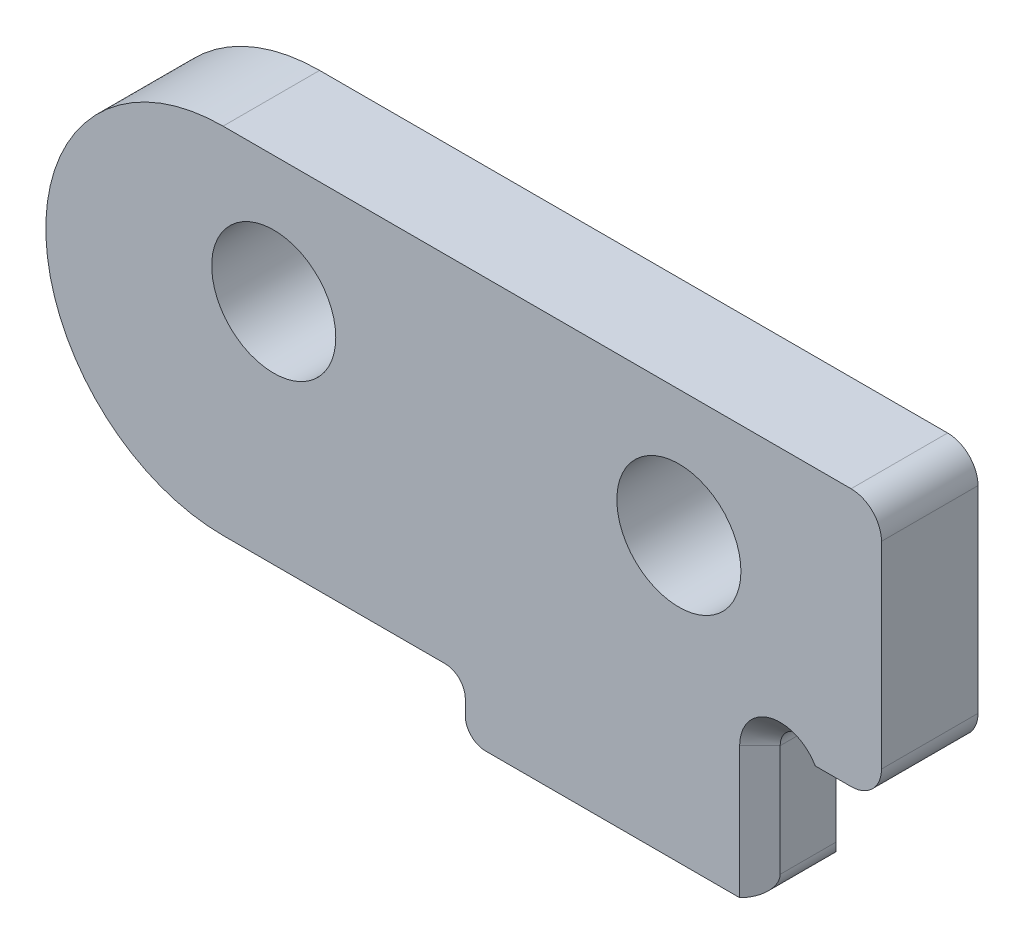
ISO-10303-21;
HEADER;
FILE_DESCRIPTION(('STEP AP214'),'2;1');
FILE_NAME('part.step','',(''),(''),'','','');
FILE_SCHEMA(('AUTOMOTIVE_DESIGN { 1 0 10303 214 1 1 1 1 }'));
ENDSEC;
DATA;
#1=APPLICATION_CONTEXT('core data for automotive mechanical design processes');
#2=APPLICATION_PROTOCOL_DEFINITION('international standard','automotive_design',2000,#1);
#3=PRODUCT_CONTEXT('',#1,'mechanical');
#4=PRODUCT('Part','Part','',(#3));
#5=PRODUCT_RELATED_PRODUCT_CATEGORY('part','',(#4));
#6=PRODUCT_DEFINITION_FORMATION('','',#4);
#7=PRODUCT_DEFINITION_CONTEXT('part definition',#1,'design');
#8=PRODUCT_DEFINITION('design','',#6,#7);
#9=PRODUCT_DEFINITION_SHAPE('','',#8);
#10=(LENGTH_UNIT() NAMED_UNIT(*) SI_UNIT(.MILLI.,.METRE.));
#11=(NAMED_UNIT(*) PLANE_ANGLE_UNIT() SI_UNIT($,.RADIAN.));
#12=(NAMED_UNIT(*) SI_UNIT($,.STERADIAN.) SOLID_ANGLE_UNIT());
#13=UNCERTAINTY_MEASURE_WITH_UNIT(LENGTH_MEASURE(1.E-05),#10,'distance_accuracy_value','');
#14=(GEOMETRIC_REPRESENTATION_CONTEXT(3) GLOBAL_UNCERTAINTY_ASSIGNED_CONTEXT((#13)) GLOBAL_UNIT_ASSIGNED_CONTEXT((#10,
#11,#12)) REPRESENTATION_CONTEXT('',''));
#15=CARTESIAN_POINT('',(0.,0.,0.));
#16=DIRECTION('',(0.,0.,1.));
#17=DIRECTION('',(1.,0.,0.));
#18=AXIS2_PLACEMENT_3D('',#15,#16,#17);
#19=CARTESIAN_POINT('',(-5.,-5.,-1.11022302462516E-13));
#20=DIRECTION('',(0.,0.,1.));
#21=DIRECTION('',(1.,0.,0.));
#22=AXIS2_PLACEMENT_3D('',#19,#20,#21);
#23=PLANE('',#22);
#24=CARTESIAN_POINT('',(40.,0.,-1.11022302462516E-13));
#25=DIRECTION('',(0.,0.,1.));
#26=DIRECTION('',(1.,0.,0.));
#27=AXIS2_PLACEMENT_3D('',#24,#25,#26);
#28=CIRCLE('',#27,6.125);
#29=CARTESIAN_POINT('',(46.125,0.,-1.12042319846968E-13));
#30=VERTEX_POINT('',#29);
#31=EDGE_CURVE('E189',#30,#30,#28,.T.);
#32=ORIENTED_EDGE('',*,*,#31,.T.);
#33=EDGE_LOOP('',(#32));
#34=FACE_BOUND('',#33,.T.);
#35=CARTESIAN_POINT('',(0.,0.,0.));
#36=DIRECTION('',(0.,0.,1.));
#37=DIRECTION('',(1.,0.,0.));
#38=AXIS2_PLACEMENT_3D('',#35,#36,#37);
#39=CIRCLE('',#38,6.125);
#40=CARTESIAN_POINT('',(6.125,0.,0.));
#41=VERTEX_POINT('',#40);
#42=EDGE_CURVE('E183',#41,#41,#39,.T.);
#43=ORIENTED_EDGE('',*,*,#42,.T.);
#44=EDGE_LOOP('',(#43));
#45=FACE_BOUND('',#44,.T.);
#46=DIRECTION('',(1.,0.,0.));
#47=VECTOR('',#46,1.);
#48=CARTESIAN_POINT('',(59.9999999999999,-12.9700000000001,1.11022302462516E-13));
#49=LINE('',#48,#47);
#50=CARTESIAN_POINT('',(53.4641016151377,-12.9700000000001,0.));
#51=VERTEX_POINT('',#50);
#52=CARTESIAN_POINT('',(56.9999999999999,-12.9700000000001,0.));
#53=VERTEX_POINT('',#52);
#54=EDGE_CURVE('E388',#51,#53,#49,.T.);
#55=ORIENTED_EDGE('',*,*,#54,.F.);
#56=CARTESIAN_POINT('',(49.9999999999999,-14.9700000000001,1.11022302462516E-13));
#57=DIRECTION('',(0.,0.,1.));
#58=DIRECTION('',(1.,0.,0.));
#59=AXIS2_PLACEMENT_3D('',#56,#57,#58);
#60=CIRCLE('',#59,4.00000000000002);
#61=CARTESIAN_POINT('',(45.9999999999999,-14.9700000000001,0.));
#62=VERTEX_POINT('',#61);
#63=EDGE_CURVE('E252',#51,#62,#60,.T.);
#64=ORIENTED_EDGE('',*,*,#63,.T.);
#65=DIRECTION('',(0.,-1.,0.));
#66=VECTOR('',#65,1.);
#67=CARTESIAN_POINT('',(45.9999999999999,-5.00000000000003,-1.11022302462516E-13));
#68=LINE('',#67,#66);
#69=CARTESIAN_POINT('',(45.9999999999998,-27.9700000000001,0.));
#70=VERTEX_POINT('',#69);
#71=EDGE_CURVE('E250',#62,#70,#68,.T.);
#72=ORIENTED_EDGE('',*,*,#71,.T.);
#73=DIRECTION('',(1.,0.,0.));
#74=VECTOR('',#73,1.);
#75=CARTESIAN_POINT('',(130.,-27.9700000000001,0.));
#76=LINE('',#75,#74);
#77=CARTESIAN_POINT('',(20.9151051592226,-27.9700000000001,0.));
#78=VERTEX_POINT('',#77);
#79=EDGE_CURVE('E198',#70,#78,#76,.F.);
#80=ORIENTED_EDGE('',*,*,#79,.T.);
#81=CARTESIAN_POINT('',(20.9151051592227,-25.97,-1.11022302462516E-13));
#82=DIRECTION('',(0.,0.,1.));
#83=DIRECTION('',(1.,0.,0.));
#84=AXIS2_PLACEMENT_3D('',#81,#82,#83);
#85=CIRCLE('',#84,2.);
#86=CARTESIAN_POINT('',(18.9151051592227,-25.97,-1.11022302462516E-13));
#87=VERTEX_POINT('',#86);
#88=EDGE_CURVE('E236',#78,#87,#85,.F.);
#89=ORIENTED_EDGE('',*,*,#88,.T.);
#90=DIRECTION('',(0.,1.,0.));
#91=VECTOR('',#90,1.);
#92=CARTESIAN_POINT('',(18.9151051592226,-27.97,0.));
#93=LINE('',#92,#91);
#94=CARTESIAN_POINT('',(18.9151051592227,-24.5,-1.11022302462516E-13));
#95=VERTEX_POINT('',#94);
#96=EDGE_CURVE('E355',#87,#95,#93,.T.);
#97=ORIENTED_EDGE('',*,*,#96,.T.);
#98=CARTESIAN_POINT('',(16.9151051592227,-24.5,-1.11022302462516E-13));
#99=DIRECTION('',(0.,0.,1.));
#100=DIRECTION('',(1.,0.,0.));
#101=AXIS2_PLACEMENT_3D('',#98,#99,#100);
#102=CIRCLE('',#101,2.);
#103=CARTESIAN_POINT('',(16.9151051592228,-22.5,-1.11022302462516E-13));
#104=VERTEX_POINT('',#103);
#105=EDGE_CURVE('E175',#95,#104,#102,.T.);
#106=ORIENTED_EDGE('',*,*,#105,.T.);
#107=DIRECTION('',(1.,0.,0.));
#108=VECTOR('',#107,1.);
#109=CARTESIAN_POINT('',(45.,-22.5,-1.11022302462516E-13));
#110=LINE('',#109,#108);
#111=CARTESIAN_POINT('',(-5.,-22.5,-1.11022302462516E-13));
#112=VERTEX_POINT('',#111);
#113=EDGE_CURVE('E158',#112,#104,#110,.T.);
#114=ORIENTED_EDGE('',*,*,#113,.F.);
#115=CARTESIAN_POINT('',(-5.,-5.,-1.11022302462516E-13));
#116=DIRECTION('',(0.,0.,1.));
#117=DIRECTION('',(1.,0.,0.));
#118=AXIS2_PLACEMENT_3D('',#115,#116,#117);
#119=CIRCLE('',#118,17.5);
#120=CARTESIAN_POINT('',(-5.00000000000012,12.5,-1.11022302462516E-13));
#121=VERTEX_POINT('',#120);
#122=EDGE_CURVE('E173',#121,#112,#119,.T.);
#123=ORIENTED_EDGE('',*,*,#122,.F.);
#124=DIRECTION('',(-1.,0.,0.));
#125=VECTOR('',#124,1.);
#126=CARTESIAN_POINT('',(-5.00000000000012,12.5,-1.11022302462516E-13));
#127=LINE('',#126,#125);
#128=CARTESIAN_POINT('',(56.9999999999999,12.5,-1.11022302462516E-13));
#129=VERTEX_POINT('',#128);
#130=EDGE_CURVE('E181',#129,#121,#127,.T.);
#131=ORIENTED_EDGE('',*,*,#130,.F.);
#132=CARTESIAN_POINT('',(56.9999999999999,9.49999999999997,-1.11022302462516E-13));
#133=DIRECTION('',(0.,0.,1.));
#134=DIRECTION('',(1.,0.,0.));
#135=AXIS2_PLACEMENT_3D('',#132,#133,#134);
#136=CIRCLE('',#135,3.);
#137=CARTESIAN_POINT('',(59.9999999999999,9.49999999999997,-1.11022302462516E-13));
#138=VERTEX_POINT('',#137);
#139=EDGE_CURVE('E209',#129,#138,#136,.F.);
#140=ORIENTED_EDGE('',*,*,#139,.T.);
#141=DIRECTION('',(0.,1.,0.));
#142=VECTOR('',#141,1.);
#143=CARTESIAN_POINT('',(59.9999999999999,-47.0300000000002,1.11022302462516E-13));
#144=LINE('',#143,#142);
#145=CARTESIAN_POINT('',(59.9999999999999,-9.97000000000006,0.));
#146=VERTEX_POINT('',#145);
#147=EDGE_CURVE('E383',#146,#138,#144,.T.);
#148=ORIENTED_EDGE('',*,*,#147,.F.);
#149=CARTESIAN_POINT('',(56.9999999999999,-9.97000000000006,-1.11022302462516E-13));
#150=DIRECTION('',(0.,0.,1.));
#151=DIRECTION('',(1.,0.,0.));
#152=AXIS2_PLACEMENT_3D('',#149,#150,#151);
#153=CIRCLE('',#152,3.);
#154=EDGE_CURVE('E211',#146,#53,#153,.F.);
#155=ORIENTED_EDGE('',*,*,#154,.T.);
#156=EDGE_LOOP('',(#55,#64,#72,#80,#89,#97,#106,#114,#123,#131,#140,#148,#155));
#157=FACE_BOUND('',#156,.T.);
#158=ADVANCED_FACE('F40',(#34,#45,#157),#23,.F.);
#159=CARTESIAN_POINT('',(-5.,-5.00000000000001,9.52999999999993));
#160=DIRECTION('',(0.,0.,1.));
#161=DIRECTION('',(1.,0.,0.));
#162=AXIS2_PLACEMENT_3D('',#159,#160,#161);
#163=PLANE('',#162);
#164=DIRECTION('',(0.,1.,0.));
#165=VECTOR('',#164,1.);
#166=CARTESIAN_POINT('',(46.,-14.9700000000001,9.53000000000004));
#167=LINE('',#166,#165);
#168=CARTESIAN_POINT('',(45.9999999999999,-27.9700000000001,9.52999999999993));
#169=VERTEX_POINT('',#168);
#170=CARTESIAN_POINT('',(46.,-14.9700000000001,9.53000000000004));
#171=VERTEX_POINT('',#170);
#172=EDGE_CURVE('E370',#169,#171,#167,.T.);
#173=ORIENTED_EDGE('',*,*,#172,.T.);
#174=CARTESIAN_POINT('',(50.,-14.9700000000001,9.53000000000004));
#175=DIRECTION('',(0.,0.,1.));
#176=DIRECTION('',(1.,0.,0.));
#177=AXIS2_PLACEMENT_3D('',#174,#175,#176);
#178=CIRCLE('',#177,4.00000000000002);
#179=CARTESIAN_POINT('',(53.4641016151377,-12.9700000000001,9.53000000000004));
#180=VERTEX_POINT('',#179);
#181=EDGE_CURVE('E366',#171,#180,#178,.F.);
#182=ORIENTED_EDGE('',*,*,#181,.T.);
#183=DIRECTION('',(1.,0.,0.));
#184=VECTOR('',#183,1.);
#185=CARTESIAN_POINT('',(59.9999999999999,-12.9700000000001,9.53000000000004));
#186=LINE('',#185,#184);
#187=CARTESIAN_POINT('',(56.9999999999999,-12.9700000000001,9.53000000000004));
#188=VERTEX_POINT('',#187);
#189=EDGE_CURVE('E390',#180,#188,#186,.T.);
#190=ORIENTED_EDGE('',*,*,#189,.T.);
#191=CARTESIAN_POINT('',(56.9999999999999,-9.97000000000006,9.52999999999993));
#192=DIRECTION('',(0.,0.,1.));
#193=DIRECTION('',(1.,0.,0.));
#194=AXIS2_PLACEMENT_3D('',#191,#192,#193);
#195=CIRCLE('',#194,3.);
#196=CARTESIAN_POINT('',(59.9999999999999,-9.97000000000006,9.53000000000004));
#197=VERTEX_POINT('',#196);
#198=EDGE_CURVE('E219',#188,#197,#195,.T.);
#199=ORIENTED_EDGE('',*,*,#198,.T.);
#200=DIRECTION('',(0.,-1.,0.));
#201=VECTOR('',#200,1.);
#202=CARTESIAN_POINT('',(59.9999999999999,-5.00000000000004,9.53000000000004));
#203=LINE('',#202,#201);
#204=CARTESIAN_POINT('',(59.9999999999999,9.49999999999997,9.52999999999993));
#205=VERTEX_POINT('',#204);
#206=EDGE_CURVE('E380',#205,#197,#203,.T.);
#207=ORIENTED_EDGE('',*,*,#206,.F.);
#208=CARTESIAN_POINT('',(56.9999999999999,9.49999999999997,9.52999999999982));
#209=DIRECTION('',(0.,0.,1.));
#210=DIRECTION('',(1.,0.,0.));
#211=AXIS2_PLACEMENT_3D('',#208,#209,#210);
#212=CIRCLE('',#211,3.);
#213=CARTESIAN_POINT('',(56.9999999999999,12.5,9.52999999999982));
#214=VERTEX_POINT('',#213);
#215=EDGE_CURVE('E217',#205,#214,#212,.T.);
#216=ORIENTED_EDGE('',*,*,#215,.T.);
#217=DIRECTION('',(1.,0.,0.));
#218=VECTOR('',#217,1.);
#219=CARTESIAN_POINT('',(-5.00000000000012,12.5,9.52999999999993));
#220=LINE('',#219,#218);
#221=CARTESIAN_POINT('',(-5.00000000000012,12.5,9.52999999999993));
#222=VERTEX_POINT('',#221);
#223=EDGE_CURVE('E192',#214,#222,#220,.F.);
#224=ORIENTED_EDGE('',*,*,#223,.T.);
#225=CARTESIAN_POINT('',(-5.,-5.00000000000001,9.52999999999993));
#226=DIRECTION('',(0.,0.,1.));
#227=DIRECTION('',(1.,0.,0.));
#228=AXIS2_PLACEMENT_3D('',#225,#226,#227);
#229=CIRCLE('',#228,17.5);
#230=CARTESIAN_POINT('',(-5.,-22.5,9.52999999999993));
#231=VERTEX_POINT('',#230);
#232=EDGE_CURVE('E195',#222,#231,#229,.T.);
#233=ORIENTED_EDGE('',*,*,#232,.T.);
#234=DIRECTION('',(1.,0.,0.));
#235=VECTOR('',#234,1.);
#236=CARTESIAN_POINT('',(-5.,-22.5,9.52999999999993));
#237=LINE('',#236,#235);
#238=CARTESIAN_POINT('',(16.9151051592228,-22.5,9.52999999999993));
#239=VERTEX_POINT('',#238);
#240=EDGE_CURVE('E161',#231,#239,#237,.T.);
#241=ORIENTED_EDGE('',*,*,#240,.T.);
#242=CARTESIAN_POINT('',(16.9151051592227,-24.5,9.52999999999993));
#243=DIRECTION('',(0.,0.,1.));
#244=DIRECTION('',(1.,0.,0.));
#245=AXIS2_PLACEMENT_3D('',#242,#243,#244);
#246=CIRCLE('',#245,2.);
#247=CARTESIAN_POINT('',(18.9151051592227,-24.5,9.52999999999993));
#248=VERTEX_POINT('',#247);
#249=EDGE_CURVE('E248',#239,#248,#246,.F.);
#250=ORIENTED_EDGE('',*,*,#249,.T.);
#251=DIRECTION('',(0.,1.,0.));
#252=VECTOR('',#251,1.);
#253=CARTESIAN_POINT('',(18.9151051592228,-27.97,9.52999999999993));
#254=LINE('',#253,#252);
#255=CARTESIAN_POINT('',(18.9151051592227,-25.97,9.52999999999993));
#256=VERTEX_POINT('',#255);
#257=EDGE_CURVE('E358',#256,#248,#254,.T.);
#258=ORIENTED_EDGE('',*,*,#257,.F.);
#259=CARTESIAN_POINT('',(20.9151051592227,-25.97,9.52999999999982));
#260=DIRECTION('',(0.,0.,1.));
#261=DIRECTION('',(1.,0.,0.));
#262=AXIS2_PLACEMENT_3D('',#259,#260,#261);
#263=CIRCLE('',#262,2.);
#264=CARTESIAN_POINT('',(20.9151051592228,-27.9700000000001,9.52999999999993));
#265=VERTEX_POINT('',#264);
#266=EDGE_CURVE('E238',#256,#265,#263,.T.);
#267=ORIENTED_EDGE('',*,*,#266,.T.);
#268=DIRECTION('',(1.,0.,0.));
#269=VECTOR('',#268,1.);
#270=CARTESIAN_POINT('',(130.,-27.9700000000001,9.53000000000004));
#271=LINE('',#270,#269);
#272=EDGE_CURVE('E374',#169,#265,#271,.F.);
#273=ORIENTED_EDGE('',*,*,#272,.F.);
#274=EDGE_LOOP('',(#173,#182,#190,#199,#207,#216,#224,#233,#241,#250,#258,#267,#273));
#275=FACE_BOUND('',#274,.T.);
#276=CARTESIAN_POINT('',(0.,0.,9.53000000000004));
#277=DIRECTION('',(0.,0.,1.));
#278=DIRECTION('',(1.,0.,0.));
#279=AXIS2_PLACEMENT_3D('',#276,#277,#278);
#280=CIRCLE('',#279,6.125);
#281=CARTESIAN_POINT('',(6.125,0.,9.53000000000004));
#282=VERTEX_POINT('',#281);
#283=EDGE_CURVE('E194',#282,#282,#280,.T.);
#284=ORIENTED_EDGE('',*,*,#283,.F.);
#285=EDGE_LOOP('',(#284));
#286=FACE_BOUND('',#285,.T.);
#287=CARTESIAN_POINT('',(40.,0.,9.52999999999993));
#288=DIRECTION('',(0.,0.,1.));
#289=DIRECTION('',(1.,0.,0.));
#290=AXIS2_PLACEMENT_3D('',#287,#288,#289);
#291=CIRCLE('',#290,6.125);
#292=CARTESIAN_POINT('',(46.125,0.,9.52999999999993));
#293=VERTEX_POINT('',#292);
#294=EDGE_CURVE('E176',#293,#293,#291,.T.);
#295=ORIENTED_EDGE('',*,*,#294,.F.);
#296=EDGE_LOOP('',(#295));
#297=FACE_BOUND('',#296,.T.);
#298=ADVANCED_FACE('F296',(#275,#286,#297),#163,.T.);
#299=CARTESIAN_POINT('',(45.,-22.5,-1.11022302462516E-13));
#300=DIRECTION('',(0.,-1.,0.));
#301=DIRECTION('',(1.,0.,0.));
#302=AXIS2_PLACEMENT_3D('',#299,#300,#301);
#303=PLANE('',#302);
#304=ORIENTED_EDGE('',*,*,#113,.T.);
#305=DIRECTION('',(0.,0.,-1.));
#306=VECTOR('',#305,1.);
#307=CARTESIAN_POINT('',(16.9151051592228,-22.5,9.52999999999993));
#308=LINE('',#307,#306);
#309=EDGE_CURVE('E228',#104,#239,#308,.F.);
#310=ORIENTED_EDGE('',*,*,#309,.T.);
#311=ORIENTED_EDGE('',*,*,#240,.F.);
#312=DIRECTION('',(0.,0.,-1.));
#313=VECTOR('',#312,1.);
#314=CARTESIAN_POINT('',(-5.,-22.5,-1.11022302462516E-13));
#315=LINE('',#314,#313);
#316=EDGE_CURVE('E155',#231,#112,#315,.T.);
#317=ORIENTED_EDGE('',*,*,#316,.T.);
#318=EDGE_LOOP('',(#304,#310,#311,#317));
#319=FACE_BOUND('',#318,.T.);
#320=ADVANCED_FACE('F157',(#319),#303,.T.);
#321=CARTESIAN_POINT('',(-5.,-5.,-1.11022302462516E-13));
#322=DIRECTION('',(0.,0.,1.));
#323=DIRECTION('',(1.,0.,0.));
#324=AXIS2_PLACEMENT_3D('',#321,#322,#323);
#325=CYLINDRICAL_SURFACE('',#324,17.5);
#326=ORIENTED_EDGE('',*,*,#316,.F.);
#327=ORIENTED_EDGE('',*,*,#232,.F.);
#328=DIRECTION('',(0.,0.,-1.));
#329=VECTOR('',#328,1.);
#330=CARTESIAN_POINT('',(-5.00000000000012,12.5,-1.11022302462516E-13));
#331=LINE('',#330,#329);
#332=EDGE_CURVE('E167',#222,#121,#331,.T.);
#333=ORIENTED_EDGE('',*,*,#332,.T.);
#334=ORIENTED_EDGE('',*,*,#122,.T.);
#335=EDGE_LOOP('',(#326,#327,#333,#334));
#336=FACE_BOUND('',#335,.T.);
#337=ADVANCED_FACE('F179',(#336),#325,.T.);
#338=CARTESIAN_POINT('',(-5.00000000000012,12.5,-1.11022302462516E-13));
#339=DIRECTION('',(0.,1.,0.));
#340=DIRECTION('',(-1.,0.,0.));
#341=AXIS2_PLACEMENT_3D('',#338,#339,#340);
#342=PLANE('',#341);
#343=ORIENTED_EDGE('',*,*,#223,.F.);
#344=DIRECTION('',(0.,0.,1.));
#345=VECTOR('',#344,1.);
#346=CARTESIAN_POINT('',(56.9999999999999,12.5,-1.11022302462516E-13));
#347=LINE('',#346,#345);
#348=EDGE_CURVE('E221',#214,#129,#347,.F.);
#349=ORIENTED_EDGE('',*,*,#348,.T.);
#350=ORIENTED_EDGE('',*,*,#130,.T.);
#351=ORIENTED_EDGE('',*,*,#332,.F.);
#352=EDGE_LOOP('',(#343,#349,#350,#351));
#353=FACE_BOUND('',#352,.T.);
#354=ADVANCED_FACE('F301',(#353),#342,.T.);
#355=CARTESIAN_POINT('',(0.,0.,0.));
#356=DIRECTION('',(0.,0.,1.));
#357=DIRECTION('',(1.,0.,0.));
#358=AXIS2_PLACEMENT_3D('',#355,#356,#357);
#359=CYLINDRICAL_SURFACE('',#358,6.125);
#360=CARTESIAN_POINT('',(6.125,0.,0.));
#361=CARTESIAN_POINT('',(6.125,0.,0.0992708333333328));
#362=CARTESIAN_POINT('',(6.125,0.,0.198541666666666));
#363=CARTESIAN_POINT('',(6.125,0.,0.397083333333334));
#364=CARTESIAN_POINT('',(6.125,0.,0.496354166666668));
#365=CARTESIAN_POINT('',(6.125,0.,0.694895833333335));
#366=CARTESIAN_POINT('',(6.125,0.,0.794166666666669));
#367=CARTESIAN_POINT('',(6.125,0.,0.992708333333336));
#368=CARTESIAN_POINT('',(6.125,0.,1.09197916666667));
#369=CARTESIAN_POINT('',(6.125,0.,1.29052083333334));
#370=CARTESIAN_POINT('',(6.125,0.,1.38979166666667));
#371=CARTESIAN_POINT('',(6.125,0.,1.58833333333334));
#372=CARTESIAN_POINT('',(6.125,0.,1.68760416666667));
#373=CARTESIAN_POINT('',(6.125,0.,1.88614583333334));
#374=CARTESIAN_POINT('',(6.125,0.,1.98541666666667));
#375=CARTESIAN_POINT('',(6.125,0.,2.18395833333334));
#376=CARTESIAN_POINT('',(6.125,0.,2.28322916666667));
#377=CARTESIAN_POINT('',(6.125,0.,2.48177083333334));
#378=CARTESIAN_POINT('',(6.125,0.,2.58104166666668));
#379=CARTESIAN_POINT('',(6.125,0.,2.77958333333334));
#380=CARTESIAN_POINT('',(6.125,0.,2.87885416666668));
#381=CARTESIAN_POINT('',(6.125,0.,3.07739583333334));
#382=CARTESIAN_POINT('',(6.125,0.,3.17666666666668));
#383=CARTESIAN_POINT('',(6.125,0.,3.37520833333334));
#384=CARTESIAN_POINT('',(6.125,0.,3.47447916666668));
#385=CARTESIAN_POINT('',(6.125,0.,3.67302083333335));
#386=CARTESIAN_POINT('',(6.125,0.,3.77229166666668));
#387=CARTESIAN_POINT('',(6.125,0.,3.97083333333335));
#388=CARTESIAN_POINT('',(6.125,0.,4.07010416666668));
#389=CARTESIAN_POINT('',(6.125,0.,4.26864583333335));
#390=CARTESIAN_POINT('',(6.125,0.,4.36791666666668));
#391=CARTESIAN_POINT('',(6.125,0.,4.56645833333335));
#392=CARTESIAN_POINT('',(6.125,0.,4.66572916666668));
#393=CARTESIAN_POINT('',(6.125,0.,4.86427083333335));
#394=CARTESIAN_POINT('',(6.125,0.,4.96354166666668));
#395=CARTESIAN_POINT('',(6.125,0.,5.16208333333335));
#396=CARTESIAN_POINT('',(6.125,0.,5.26135416666668));
#397=CARTESIAN_POINT('',(6.125,0.,5.45989583333335));
#398=CARTESIAN_POINT('',(6.125,0.,5.55916666666669));
#399=CARTESIAN_POINT('',(6.125,0.,5.75770833333335));
#400=CARTESIAN_POINT('',(6.125,0.,5.85697916666669));
#401=CARTESIAN_POINT('',(6.125,0.,6.05552083333336));
#402=CARTESIAN_POINT('',(6.125,0.,6.15479166666669));
#403=CARTESIAN_POINT('',(6.125,0.,6.35333333333336));
#404=CARTESIAN_POINT('',(6.125,0.,6.45260416666669));
#405=CARTESIAN_POINT('',(6.125,0.,6.65114583333336));
#406=CARTESIAN_POINT('',(6.125,0.,6.75041666666669));
#407=CARTESIAN_POINT('',(6.125,0.,6.94895833333336));
#408=CARTESIAN_POINT('',(6.125,0.,7.04822916666669));
#409=CARTESIAN_POINT('',(6.125,0.,7.24677083333336));
#410=CARTESIAN_POINT('',(6.125,0.,7.34604166666669));
#411=CARTESIAN_POINT('',(6.125,0.,7.54458333333336));
#412=CARTESIAN_POINT('',(6.125,0.,7.64385416666669));
#413=CARTESIAN_POINT('',(6.125,0.,7.84239583333336));
#414=CARTESIAN_POINT('',(6.125,0.,7.9416666666667));
#415=CARTESIAN_POINT('',(6.125,0.,8.14020833333336));
#416=CARTESIAN_POINT('',(6.125,0.,8.2394791666667));
#417=CARTESIAN_POINT('',(6.125,0.,8.43802083333336));
#418=CARTESIAN_POINT('',(6.125,0.,8.5372916666667));
#419=CARTESIAN_POINT('',(6.125,0.,8.73583333333337));
#420=CARTESIAN_POINT('',(6.125,0.,8.8351041666667));
#421=CARTESIAN_POINT('',(6.125,0.,9.03364583333337));
#422=CARTESIAN_POINT('',(6.125,0.,9.1329166666667));
#423=CARTESIAN_POINT('',(6.125,0.,9.33145833333337));
#424=CARTESIAN_POINT('',(6.125,0.,9.4307291666667));
#425=CARTESIAN_POINT('',(6.125,0.,9.53000000000004));
#426=B_SPLINE_CURVE_WITH_KNOTS('',3,(#360,#361,#362,#363,#364,#365,#366,#367,#368,#369,#370,
#371,#372,#373,#374,#375,#376,#377,#378,#379,#380,#381,#382,#383,#384,#385,#386,#387,#388,#389,
#390,#391,#392,#393,#394,#395,#396,#397,#398,#399,#400,#401,#402,#403,#404,#405,#406,#407,#408,
#409,#410,#411,#412,#413,#414,#415,#416,#417,#418,#419,#420,#421,#422,#423,#424,#425),
.UNSPECIFIED.,.F.,.F.,(4,2,2,2,2,2,2,2,2,2,2,2,2,2,2,2,2,2,2,2,2,2,2,2,2,2,2,2,2,2,2,2,4),(0.,
0.297812500000001,0.595625000000002,0.893437500000003,1.19125,1.48906250000001,1.78687500000001,
2.08468750000001,2.38250000000001,2.68031250000001,2.97812500000001,3.27593750000001,
3.57375000000001,3.87156250000001,4.16937500000002,4.46718750000002,4.76500000000002,
5.06281250000002,5.36062500000002,5.65843750000002,5.95625000000002,6.25406250000002,
6.55187500000002,6.84968750000002,7.14750000000003,7.44531250000003,7.74312500000003,
8.04093750000003,8.33875000000003,8.63656250000004,8.93437500000004,9.23218750000004,
9.53000000000004),.UNSPECIFIED.);
#427=EDGE_CURVE('BSEAM304',#41,#282,#426,.T.);
#428=ORIENTED_EDGE('',*,*,#42,.F.);
#429=ORIENTED_EDGE('',*,*,#283,.T.);
#430=ORIENTED_EDGE('',*,*,#427,.T.);
#431=ORIENTED_EDGE('',*,*,#427,.F.);
#432=EDGE_LOOP('',(#428,#430,#429,#431));
#433=FACE_BOUND('',#432,.T.);
#434=ADVANCED_FACE('F304',(#433),#359,.F.);
#435=CARTESIAN_POINT('',(40.,0.,-1.11022302462516E-13));
#436=DIRECTION('',(0.,0.,1.));
#437=DIRECTION('',(1.,0.,0.));
#438=AXIS2_PLACEMENT_3D('',#435,#436,#437);
#439=CYLINDRICAL_SURFACE('',#438,6.125);
#440=CARTESIAN_POINT('',(46.125,0.,-1.12042319846968E-13));
#441=CARTESIAN_POINT('',(46.125,0.,0.0992708333332218));
#442=CARTESIAN_POINT('',(46.125,0.,0.198541666666555));
#443=CARTESIAN_POINT('',(46.125,0.,0.397083333333223));
#444=CARTESIAN_POINT('',(46.125,0.,0.496354166666557));
#445=CARTESIAN_POINT('',(46.125,0.,0.694895833333224));
#446=CARTESIAN_POINT('',(46.125,0.,0.794166666666558));
#447=CARTESIAN_POINT('',(46.125,0.,0.992708333333225));
#448=CARTESIAN_POINT('',(46.125,0.,1.09197916666656));
#449=CARTESIAN_POINT('',(46.125,0.,1.29052083333323));
#450=CARTESIAN_POINT('',(46.125,0.,1.38979166666656));
#451=CARTESIAN_POINT('',(46.125,0.,1.58833333333323));
#452=CARTESIAN_POINT('',(46.125,0.,1.68760416666656));
#453=CARTESIAN_POINT('',(46.125,0.,1.88614583333323));
#454=CARTESIAN_POINT('',(46.125,0.,1.98541666666656));
#455=CARTESIAN_POINT('',(46.125,0.,2.18395833333323));
#456=CARTESIAN_POINT('',(46.125,0.,2.28322916666656));
#457=CARTESIAN_POINT('',(46.125,0.,2.48177083333323));
#458=CARTESIAN_POINT('',(46.125,0.,2.58104166666656));
#459=CARTESIAN_POINT('',(46.125,0.,2.77958333333323));
#460=CARTESIAN_POINT('',(46.125,0.,2.87885416666657));
#461=CARTESIAN_POINT('',(46.125,0.,3.07739583333323));
#462=CARTESIAN_POINT('',(46.125,0.,3.17666666666657));
#463=CARTESIAN_POINT('',(46.125,0.,3.37520833333323));
#464=CARTESIAN_POINT('',(46.125,0.,3.47447916666657));
#465=CARTESIAN_POINT('',(46.125,0.,3.67302083333323));
#466=CARTESIAN_POINT('',(46.125,0.,3.77229166666657));
#467=CARTESIAN_POINT('',(46.125,0.,3.97083333333324));
#468=CARTESIAN_POINT('',(46.125,0.,4.07010416666657));
#469=CARTESIAN_POINT('',(46.125,0.,4.26864583333324));
#470=CARTESIAN_POINT('',(46.125,0.,4.36791666666657));
#471=CARTESIAN_POINT('',(46.125,0.,4.56645833333324));
#472=CARTESIAN_POINT('',(46.125,0.,4.66572916666657));
#473=CARTESIAN_POINT('',(46.125,0.,4.86427083333324));
#474=CARTESIAN_POINT('',(46.125,0.,4.96354166666657));
#475=CARTESIAN_POINT('',(46.125,0.,5.16208333333324));
#476=CARTESIAN_POINT('',(46.125,0.,5.26135416666657));
#477=CARTESIAN_POINT('',(46.125,0.,5.45989583333324));
#478=CARTESIAN_POINT('',(46.125,0.,5.55916666666658));
#479=CARTESIAN_POINT('',(46.125,0.,5.75770833333324));
#480=CARTESIAN_POINT('',(46.125,0.,5.85697916666658));
#481=CARTESIAN_POINT('',(46.125,0.,6.05552083333324));
#482=CARTESIAN_POINT('',(46.125,0.,6.15479166666658));
#483=CARTESIAN_POINT('',(46.125,0.,6.35333333333325));
#484=CARTESIAN_POINT('',(46.125,0.,6.45260416666658));
#485=CARTESIAN_POINT('',(46.125,0.,6.65114583333325));
#486=CARTESIAN_POINT('',(46.125,0.,6.75041666666658));
#487=CARTESIAN_POINT('',(46.125,0.,6.94895833333325));
#488=CARTESIAN_POINT('',(46.125,0.,7.04822916666658));
#489=CARTESIAN_POINT('',(46.125,0.,7.24677083333325));
#490=CARTESIAN_POINT('',(46.125,0.,7.34604166666658));
#491=CARTESIAN_POINT('',(46.125,0.,7.54458333333325));
#492=CARTESIAN_POINT('',(46.125,0.,7.64385416666658));
#493=CARTESIAN_POINT('',(46.125,0.,7.84239583333325));
#494=CARTESIAN_POINT('',(46.125,0.,7.94166666666659));
#495=CARTESIAN_POINT('',(46.125,0.,8.14020833333325));
#496=CARTESIAN_POINT('',(46.125,0.,8.23947916666659));
#497=CARTESIAN_POINT('',(46.125,0.,8.43802083333325));
#498=CARTESIAN_POINT('',(46.125,0.,8.53729166666659));
#499=CARTESIAN_POINT('',(46.125,0.,8.73583333333326));
#500=CARTESIAN_POINT('',(46.125,0.,8.83510416666659));
#501=CARTESIAN_POINT('',(46.125,0.,9.03364583333326));
#502=CARTESIAN_POINT('',(46.125,0.,9.13291666666659));
#503=CARTESIAN_POINT('',(46.125,0.,9.33145833333326));
#504=CARTESIAN_POINT('',(46.125,0.,9.43072916666659));
#505=CARTESIAN_POINT('',(46.125,0.,9.52999999999993));
#506=B_SPLINE_CURVE_WITH_KNOTS('',3,(#440,#441,#442,#443,#444,#445,#446,#447,#448,#449,#450,
#451,#452,#453,#454,#455,#456,#457,#458,#459,#460,#461,#462,#463,#464,#465,#466,#467,#468,#469,
#470,#471,#472,#473,#474,#475,#476,#477,#478,#479,#480,#481,#482,#483,#484,#485,#486,#487,#488,
#489,#490,#491,#492,#493,#494,#495,#496,#497,#498,#499,#500,#501,#502,#503,#504,#505),
.UNSPECIFIED.,.F.,.F.,(4,2,2,2,2,2,2,2,2,2,2,2,2,2,2,2,2,2,2,2,2,2,2,2,2,2,2,2,2,2,2,2,4),(0.,
0.297812500000001,0.595625000000002,0.893437500000003,1.19125,1.48906250000001,1.78687500000001,
2.08468750000001,2.38250000000001,2.68031250000001,2.97812500000001,3.27593750000001,
3.57375000000001,3.87156250000001,4.16937500000002,4.46718750000002,4.76500000000002,
5.06281250000002,5.36062500000002,5.65843750000002,5.95625000000002,6.25406250000002,
6.55187500000002,6.84968750000002,7.14750000000003,7.44531250000003,7.74312500000003,
8.04093750000003,8.33875000000003,8.63656250000004,8.93437500000004,9.23218750000004,
9.53000000000004),.UNSPECIFIED.);
#507=EDGE_CURVE('BSEAM292',#30,#293,#506,.T.);
#508=ORIENTED_EDGE('',*,*,#31,.F.);
#509=ORIENTED_EDGE('',*,*,#294,.T.);
#510=ORIENTED_EDGE('',*,*,#507,.T.);
#511=ORIENTED_EDGE('',*,*,#507,.F.);
#512=EDGE_LOOP('',(#508,#510,#509,#511));
#513=FACE_BOUND('',#512,.T.);
#514=ADVANCED_FACE('F292',(#513),#439,.F.);
#515=CARTESIAN_POINT('',(59.9999999999999,-47.0300000000002,1.11022302462516E-13));
#516=DIRECTION('',(-1.,0.,0.));
#517=DIRECTION('',(0.,0.,1.));
#518=AXIS2_PLACEMENT_3D('',#515,#516,#517);
#519=PLANE('',#518);
#520=ORIENTED_EDGE('',*,*,#206,.T.);
#521=DIRECTION('',(0.,0.,-1.));
#522=VECTOR('',#521,1.);
#523=CARTESIAN_POINT('',(59.9999999999999,-9.97000000000006,0.));
#524=LINE('',#523,#522);
#525=EDGE_CURVE('E206',#197,#146,#524,.T.);
#526=ORIENTED_EDGE('',*,*,#525,.T.);
#527=ORIENTED_EDGE('',*,*,#147,.T.);
#528=DIRECTION('',(0.,0.,1.));
#529=VECTOR('',#528,1.);
#530=CARTESIAN_POINT('',(59.9999999999999,9.49999999999997,9.52999999999993));
#531=LINE('',#530,#529);
#532=EDGE_CURVE('E166',#138,#205,#531,.T.);
#533=ORIENTED_EDGE('',*,*,#532,.T.);
#534=EDGE_LOOP('',(#520,#526,#527,#533));
#535=FACE_BOUND('',#534,.T.);
#536=ADVANCED_FACE('F288',(#535),#519,.F.);
#537=CARTESIAN_POINT('',(59.9999999999998,-27.97,-1.19999999936837E-05));
#538=DIRECTION('',(0.,1.,0.));
#539=DIRECTION('',(0.,0.,1.));
#540=AXIS2_PLACEMENT_3D('',#537,#538,#539);
#541=PLANE('',#540);
#542=ORIENTED_EDGE('',*,*,#272,.T.);
#543=DIRECTION('',(0.,0.,-1.));
#544=VECTOR('',#543,1.);
#545=CARTESIAN_POINT('',(20.9151051592226,-27.97,0.));
#546=LINE('',#545,#544);
#547=EDGE_CURVE('E233',#265,#78,#546,.T.);
#548=ORIENTED_EDGE('',*,*,#547,.T.);
#549=ORIENTED_EDGE('',*,*,#79,.F.);
#550=DIRECTION('',(0.,0.,-1.));
#551=VECTOR('',#550,1.);
#552=CARTESIAN_POINT('',(45.9999999999998,-27.97,-1.2000000104706E-05));
#553=LINE('',#552,#551);
#554=EDGE_CURVE('E230',#70,#169,#553,.F.);
#555=ORIENTED_EDGE('',*,*,#554,.T.);
#556=EDGE_LOOP('',(#542,#548,#549,#555));
#557=FACE_BOUND('',#556,.T.);
#558=ADVANCED_FACE('F280',(#557),#541,.F.);
#559=CARTESIAN_POINT('',(59.9999999999999,-12.9700000000001,9.53100000000007));
#560=DIRECTION('',(0.,1.,0.));
#561=DIRECTION('',(0.,0.,1.));
#562=AXIS2_PLACEMENT_3D('',#559,#560,#561);
#563=PLANE('',#562);
#564=DIRECTION('',(0.,0.,-1.));
#565=VECTOR('',#564,1.);
#566=CARTESIAN_POINT('',(49.9999999999999,-12.9700000000001,1.11022302462516E-13));
#567=LINE('',#566,#565);
#568=CARTESIAN_POINT('',(49.9999999999998,-12.9700000000001,7.53000000000004));
#569=VERTEX_POINT('',#568);
#570=CARTESIAN_POINT('',(49.9999999999999,-12.9700000000001,2.00000000000011));
#571=VERTEX_POINT('',#570);
#572=EDGE_CURVE('E244',#569,#571,#567,.T.);
#573=ORIENTED_EDGE('',*,*,#572,.T.);
#574=CARTESIAN_POINT('',(49.9999999999999,-12.9700000000001,2.00000000000011));
#575=CARTESIAN_POINT('',(50.061564833947,-12.9700000000001,2.00005176572461));
#576=CARTESIAN_POINT('',(50.1230976626788,-12.9700000000001,1.9971585502594));
#577=CARTESIAN_POINT('',(50.2455362294203,-12.9700000000001,1.98589102696677));
#578=CARTESIAN_POINT('',(50.3064430019593,-12.9700000000001,1.97752807907218));
#579=CARTESIAN_POINT('',(50.4261958383062,-12.9700000000001,1.95593049475139));
#580=CARTESIAN_POINT('',(50.485059143122,-12.9700000000001,1.94278978148452));
#581=CARTESIAN_POINT('',(50.6016728667982,-12.9700000000001,1.91221486739236));
#582=CARTESIAN_POINT('',(50.6594227342811,-12.9700000000001,1.89477859543394));
#583=CARTESIAN_POINT('',(50.8415598339028,-12.9700000000001,1.83335552415621));
#584=CARTESIAN_POINT('',(50.9636109357224,-12.9700000000001,1.78243451525741));
#585=CARTESIAN_POINT('',(51.202154451949,-12.9700000000001,1.66888000930271));
#586=CARTESIAN_POINT('',(51.3186359372818,-12.9700000000001,1.60622458207993));
#587=CARTESIAN_POINT('',(51.5494514386514,-12.9700000000001,1.47179184604234));
#588=CARTESIAN_POINT('',(51.6636883568858,-12.9700000000001,1.39985002688002));
#589=CARTESIAN_POINT('',(51.8884286612424,-12.9700000000001,1.25061398588688));
#590=CARTESIAN_POINT('',(51.9989349237162,-12.9700000000001,1.17332403451695));
#591=CARTESIAN_POINT('',(52.2279359317265,-12.9700000000001,1.00719291087925));
#592=CARTESIAN_POINT('',(52.346147096867,-12.9700000000001,0.917963373628273));
#593=CARTESIAN_POINT('',(52.5801303261181,-12.9700000000001,0.736312929206818));
#594=CARTESIAN_POINT('',(52.6959016622739,-12.9700000000001,0.643891090683658));
#595=CARTESIAN_POINT('',(52.9211519791872,-12.9700000000001,0.460364849715472));
#596=CARTESIAN_POINT('',(53.0307015944076,-12.9700000000001,0.36934676061162));
#597=CARTESIAN_POINT('',(53.2483684543347,-12.9700000000001,0.1857408444021));
#598=CARTESIAN_POINT('',(53.3564865081205,-12.9700000000001,0.0931539778474287));
#599=CARTESIAN_POINT('',(53.4641016151377,-12.9700000000001,0.));
#600=B_SPLINE_CURVE_WITH_KNOTS('',3,(#574,#575,#576,#577,#578,#579,#580,#581,#582,#583,#584,
#585,#586,#587,#588,#589,#590,#591,#592,#593,#594,#595,#596,#597,#598,#599),.UNSPECIFIED.,.F.,
.F.,(4,2,2,2,2,2,2,2,2,2,2,2,4),(0.,0.184575333762295,0.36876854031799,0.54952095273893,
0.730360687332557,1.12602877765822,1.5224438378002,1.92721918468234,2.33167496906159,
2.77591931243709,3.22029437723617,3.64755775641141,4.07456835675901),.UNSPECIFIED.);
#601=EDGE_CURVE('E265',#571,#51,#600,.T.);
#602=ORIENTED_EDGE('',*,*,#601,.T.);
#603=ORIENTED_EDGE('',*,*,#54,.T.);
#604=DIRECTION('',(0.,0.,-1.));
#605=VECTOR('',#604,1.);
#606=CARTESIAN_POINT('',(56.9999999999999,-12.9700000000001,9.53100000000007));
#607=LINE('',#606,#605);
#608=EDGE_CURVE('E214',#53,#188,#607,.F.);
#609=ORIENTED_EDGE('',*,*,#608,.T.);
#610=ORIENTED_EDGE('',*,*,#189,.F.);
#611=CARTESIAN_POINT('',(53.4641016151377,-12.9700000000001,9.53000000000004));
#612=CARTESIAN_POINT('',(53.4026113766207,-12.9700000000001,9.47675023760091));
#613=CARTESIAN_POINT('',(53.3409484105441,-12.9700000000001,9.4237001532251));
#614=CARTESIAN_POINT('',(53.2172191131509,-12.9700000000001,9.31806795498699));
#615=CARTESIAN_POINT('',(53.1551527668676,-12.9700000000001,9.26548585866208));
#616=CARTESIAN_POINT('',(52.9681473462912,-12.9700000000001,9.10844852926436));
#617=CARTESIAN_POINT('',(52.8425214505033,-12.9700000000001,9.0048062578393));
#618=CARTESIAN_POINT('',(52.5842628380632,-12.9700000000001,8.79685375995626));
#619=CARTESIAN_POINT('',(52.451540778237,-12.9700000000001,8.69265411093396));
#620=CARTESIAN_POINT('',(52.1825379124409,-12.9700000000001,8.48900296490195));
#621=CARTESIAN_POINT('',(52.0462585742423,-12.9700000000001,8.38954955599173));
#622=CARTESIAN_POINT('',(51.8262987735825,-12.9700000000001,8.23775774880961));
#623=CARTESIAN_POINT('',(51.7442865342126,-12.9700000000001,8.18301023933815));
#624=CARTESIAN_POINT('',(51.5781123085138,-12.9700000000001,8.07682957224512));
#625=CARTESIAN_POINT('',(51.4939500733912,-12.9700000000001,8.02539680064728));
#626=CARTESIAN_POINT('',(51.3242756692687,-12.9700000000001,7.92769989904042));
#627=CARTESIAN_POINT('',(51.2388007572655,-12.9700000000001,7.88137164926027));
#628=CARTESIAN_POINT('',(51.0648812383955,-12.9700000000001,7.79457361944341));
#629=CARTESIAN_POINT('',(50.9764369088699,-12.97,7.75410329414628));
#630=CARTESIAN_POINT('',(50.8167001037214,-12.9700000000001,7.68938694586498));
#631=CARTESIAN_POINT('',(50.746061627141,-12.9700000000001,7.6635424754166));
#632=CARTESIAN_POINT('',(50.6029374528819,-12.9700000000001,7.61780784222918));
#633=CARTESIAN_POINT('',(50.5304538155914,-12.9700000000001,7.5979113291513));
#634=CARTESIAN_POINT('',(50.3823102247721,-12.9700000000001,7.56490924589325));
#635=CARTESIAN_POINT('',(50.3066155452224,-12.9700000000001,7.55195443334036));
#636=CARTESIAN_POINT('',(50.1922172348795,-12.9700000000001,7.53885514097671));
#637=CARTESIAN_POINT('',(50.1538599128525,-12.9700000000001,7.53554394956794));
#638=CARTESIAN_POINT('',(50.0770048065338,-12.9700000000001,7.53111282569037));
#639=CARTESIAN_POINT('',(50.038506974531,-12.9700000000001,7.52999372390042));
#640=CARTESIAN_POINT('',(49.9999999999998,-12.9700000000001,7.53000000000004));
#641=B_SPLINE_CURVE_WITH_KNOTS('',3,(#611,#612,#613,#614,#615,#616,#617,#618,#619,#620,#621,
#622,#623,#624,#625,#626,#627,#628,#629,#630,#631,#632,#633,#634,#635,#636,#637,#638,#639,#640),
.UNSPECIFIED.,.F.,.F.,(4,2,2,2,2,2,2,2,2,2,2,2,2,2,4),(0.,0.244026124703893,0.488061355871669,
0.976607160337956,1.48276241738852,1.98871203141772,2.28447498290609,2.58027231598977,
2.87178153626233,3.16326360514438,3.38870589795094,3.6139066304693,3.8438180738405,
3.95926195802253,4.07474958049572),.UNSPECIFIED.);
#642=EDGE_CURVE('E259',#180,#569,#641,.T.);
#643=ORIENTED_EDGE('',*,*,#642,.T.);
#644=EDGE_LOOP('',(#573,#602,#603,#609,#610,#643));
#645=FACE_BOUND('',#644,.T.);
#646=ADVANCED_FACE('F274',(#645),#563,.F.);
#647=CARTESIAN_POINT('',(47.9999999999999,-27.97,9.53099999999996));
#648=DIRECTION('',(-1.,0.,0.));
#649=DIRECTION('',(0.,0.,1.));
#650=AXIS2_PLACEMENT_3D('',#647,#648,#649);
#651=PLANE('',#650);
#652=DIRECTION('',(0.,0.,-1.));
#653=VECTOR('',#652,1.);
#654=CARTESIAN_POINT('',(48.,-14.9700000000001,9.52999999999993));
#655=LINE('',#654,#653);
#656=CARTESIAN_POINT('',(47.9999999999999,-14.9700000000001,1.99999999999989));
#657=VERTEX_POINT('',#656);
#658=CARTESIAN_POINT('',(47.9999999999999,-14.9700000000001,7.52999999999993));
#659=VERTEX_POINT('',#658);
#660=EDGE_CURVE('E240',#657,#659,#655,.F.);
#661=ORIENTED_EDGE('',*,*,#660,.T.);
#662=DIRECTION('',(0.,-1.,0.));
#663=VECTOR('',#662,1.);
#664=CARTESIAN_POINT('',(47.9999999999999,-25.9700000000001,7.52999999999981));
#665=LINE('',#664,#663);
#666=CARTESIAN_POINT('',(47.9999999999999,-25.9700000000001,7.52999999999981));
#667=VERTEX_POINT('',#666);
#668=EDGE_CURVE('E63',#659,#667,#665,.T.);
#669=ORIENTED_EDGE('',*,*,#668,.T.);
#670=DIRECTION('',(0.,0.,-1.));
#671=VECTOR('',#670,1.);
#672=CARTESIAN_POINT('',(47.9999999999999,-25.9700000000001,9.53099999999985));
#673=LINE('',#672,#671);
#674=CARTESIAN_POINT('',(47.9999999999998,-25.9700000000001,1.99999999999978));
#675=VERTEX_POINT('',#674);
#676=EDGE_CURVE('E242',#667,#675,#673,.T.);
#677=ORIENTED_EDGE('',*,*,#676,.T.);
#678=DIRECTION('',(0.,1.,0.));
#679=VECTOR('',#678,1.);
#680=CARTESIAN_POINT('',(47.9999999999999,-27.97,1.99999999999989));
#681=LINE('',#680,#679);
#682=EDGE_CURVE('E350',#675,#657,#681,.T.);
#683=ORIENTED_EDGE('',*,*,#682,.T.);
#684=EDGE_LOOP('',(#661,#669,#677,#683));
#685=FACE_BOUND('',#684,.T.);
#686=ADVANCED_FACE('F279',(#685),#651,.F.);
#687=CARTESIAN_POINT('',(18.9151051592228,-27.97,35.1214223911059));
#688=DIRECTION('',(-1.,0.,0.));
#689=DIRECTION('',(0.,0.,1.));
#690=AXIS2_PLACEMENT_3D('',#687,#688,#689);
#691=PLANE('',#690);
#692=ORIENTED_EDGE('',*,*,#257,.T.);
#693=DIRECTION('',(0.,0.,-1.));
#694=VECTOR('',#693,1.);
#695=CARTESIAN_POINT('',(18.9151051592227,-24.5,-1.11022302462516E-13));
#696=LINE('',#695,#694);
#697=EDGE_CURVE('E225',#248,#95,#696,.T.);
#698=ORIENTED_EDGE('',*,*,#697,.T.);
#699=ORIENTED_EDGE('',*,*,#96,.F.);
#700=DIRECTION('',(0.,0.,-1.));
#701=VECTOR('',#700,1.);
#702=CARTESIAN_POINT('',(18.9151051592227,-25.97,9.52999999999993));
#703=LINE('',#702,#701);
#704=EDGE_CURVE('E223',#87,#256,#703,.F.);
#705=ORIENTED_EDGE('',*,*,#704,.T.);
#706=EDGE_LOOP('',(#692,#698,#699,#705));
#707=FACE_BOUND('',#706,.T.);
#708=ADVANCED_FACE('F282',(#707),#691,.T.);
#709=CARTESIAN_POINT('',(56.9999999999999,-9.97000000000006,-1.11022302462516E-13));
#710=DIRECTION('',(0.,0.,-1.));
#711=DIRECTION('',(-1.,0.,0.));
#712=AXIS2_PLACEMENT_3D('',#709,#710,#711);
#713=CYLINDRICAL_SURFACE('',#712,3.);
#714=ORIENTED_EDGE('',*,*,#198,.F.);
#715=ORIENTED_EDGE('',*,*,#608,.F.);
#716=ORIENTED_EDGE('',*,*,#154,.F.);
#717=ORIENTED_EDGE('',*,*,#525,.F.);
#718=EDGE_LOOP('',(#714,#715,#716,#717));
#719=FACE_BOUND('',#718,.T.);
#720=ADVANCED_FACE('F316',(#719),#713,.T.);
#721=CARTESIAN_POINT('',(56.9999999999999,9.49999999999997,-1.11022302462516E-13));
#722=DIRECTION('',(0.,0.,-1.));
#723=DIRECTION('',(-1.,0.,0.));
#724=AXIS2_PLACEMENT_3D('',#721,#722,#723);
#725=CYLINDRICAL_SURFACE('',#724,3.);
#726=ORIENTED_EDGE('',*,*,#139,.F.);
#727=ORIENTED_EDGE('',*,*,#348,.F.);
#728=ORIENTED_EDGE('',*,*,#215,.F.);
#729=ORIENTED_EDGE('',*,*,#532,.F.);
#730=EDGE_LOOP('',(#726,#727,#728,#729));
#731=FACE_BOUND('',#730,.T.);
#732=ADVANCED_FACE('F319',(#731),#725,.T.);
#733=CARTESIAN_POINT('',(16.9151051592227,-24.5,35.1214223911059));
#734=DIRECTION('',(0.,0.,1.));
#735=DIRECTION('',(1.,0.,0.));
#736=AXIS2_PLACEMENT_3D('',#733,#734,#735);
#737=CYLINDRICAL_SURFACE('',#736,2.);
#738=ORIENTED_EDGE('',*,*,#249,.F.);
#739=ORIENTED_EDGE('',*,*,#309,.F.);
#740=ORIENTED_EDGE('',*,*,#105,.F.);
#741=ORIENTED_EDGE('',*,*,#697,.F.);
#742=EDGE_LOOP('',(#738,#739,#740,#741));
#743=FACE_BOUND('',#742,.T.);
#744=ADVANCED_FACE('F323',(#743),#737,.F.);
#745=CARTESIAN_POINT('',(20.9151051592227,-25.97,-1.2000000104706E-05));
#746=DIRECTION('',(0.,0.,1.));
#747=DIRECTION('',(1.,0.,0.));
#748=AXIS2_PLACEMENT_3D('',#745,#746,#747);
#749=CYLINDRICAL_SURFACE('',#748,2.);
#750=ORIENTED_EDGE('',*,*,#266,.F.);
#751=ORIENTED_EDGE('',*,*,#704,.F.);
#752=ORIENTED_EDGE('',*,*,#88,.F.);
#753=ORIENTED_EDGE('',*,*,#547,.F.);
#754=EDGE_LOOP('',(#750,#751,#752,#753));
#755=FACE_BOUND('',#754,.T.);
#756=ADVANCED_FACE('F327',(#755),#749,.T.);
#757=CARTESIAN_POINT('',(45.9999999999999,-25.9700000000001,9.53099999999985));
#758=DIRECTION('',(0.,0.,-1.));
#759=DIRECTION('',(-1.,0.,0.));
#760=AXIS2_PLACEMENT_3D('',#757,#758,#759);
#761=CYLINDRICAL_SURFACE('',#760,2.);
#762=ORIENTED_EDGE('',*,*,#676,.F.);
#763=CARTESIAN_POINT('',(45.9999999999999,-25.9700000000001,9.52999999999982));
#764=DIRECTION('',(0.70710678118655,0.,0.707106781186545));
#765=DIRECTION('',(0.707106781186545,0.,-0.70710678118655));
#766=AXIS2_PLACEMENT_3D('',#763,#764,#765);
#767=ELLIPSE('',#766,2.8284271247462,2.);
#768=EDGE_CURVE('E11',#667,#169,#767,.F.);
#769=ORIENTED_EDGE('',*,*,#768,.T.);
#770=ORIENTED_EDGE('',*,*,#554,.F.);
#771=CARTESIAN_POINT('',(45.9999999999999,-25.9700000000001,-1.11022302462516E-13));
#772=DIRECTION('',(-0.707106781186545,0.,0.70710678118655));
#773=DIRECTION('',(-0.70710678118655,0.,-0.707106781186545));
#774=AXIS2_PLACEMENT_3D('',#771,#772,#773);
#775=ELLIPSE('',#774,2.82842712474618,2.);
#776=EDGE_CURVE('E49',#70,#675,#775,.T.);
#777=ORIENTED_EDGE('',*,*,#776,.T.);
#778=EDGE_LOOP('',(#762,#769,#770,#777));
#779=FACE_BOUND('',#778,.T.);
#780=ADVANCED_FACE('F331',(#779),#761,.T.);
#781=CARTESIAN_POINT('',(50.,-14.9700000000001,9.53100000000007));
#782=DIRECTION('',(0.,0.,1.));
#783=DIRECTION('',(1.,0.,0.));
#784=AXIS2_PLACEMENT_3D('',#781,#782,#783);
#785=CYLINDRICAL_SURFACE('',#784,2.);
#786=ORIENTED_EDGE('',*,*,#660,.F.);
#787=CARTESIAN_POINT('',(49.9999999999999,-14.9700000000001,2.00000000000011));
#788=DIRECTION('',(0.,0.,1.));
#789=DIRECTION('',(1.,0.,0.));
#790=AXIS2_PLACEMENT_3D('',#787,#788,#789);
#791=CIRCLE('',#790,2.);
#792=EDGE_CURVE('E257',#657,#571,#791,.F.);
#793=ORIENTED_EDGE('',*,*,#792,.T.);
#794=ORIENTED_EDGE('',*,*,#572,.F.);
#795=CARTESIAN_POINT('',(49.9999999999999,-14.9700000000001,7.53000000000004));
#796=DIRECTION('',(0.,0.,1.));
#797=DIRECTION('',(1.,0.,0.));
#798=AXIS2_PLACEMENT_3D('',#795,#796,#797);
#799=CIRCLE('',#798,2.);
#800=EDGE_CURVE('E255',#569,#659,#799,.T.);
#801=ORIENTED_EDGE('',*,*,#800,.T.);
#802=EDGE_LOOP('',(#786,#793,#794,#801));
#803=FACE_BOUND('',#802,.T.);
#804=ADVANCED_FACE('F335',(#803),#785,.F.);
#805=CARTESIAN_POINT('',(47.9999999999999,-27.97,1.99999999999989));
#806=DIRECTION('',(-0.707106781186545,0.,0.70710678118655));
#807=DIRECTION('',(0.,1.,0.));
#808=AXIS2_PLACEMENT_3D('',#805,#806,#807);
#809=PLANE('',#808);
#810=ORIENTED_EDGE('',*,*,#776,.F.);
#811=ORIENTED_EDGE('',*,*,#71,.F.);
#812=DIRECTION('',(-0.70710678118655,0.,-0.707106781186545));
#813=VECTOR('',#812,1.);
#814=CARTESIAN_POINT('',(47.9999999999999,-14.9700000000001,1.99999999999989));
#815=LINE('',#814,#813);
#816=EDGE_CURVE('E354',#657,#62,#815,.T.);
#817=ORIENTED_EDGE('',*,*,#816,.F.);
#818=ORIENTED_EDGE('',*,*,#682,.F.);
#819=EDGE_LOOP('',(#810,#811,#817,#818));
#820=FACE_BOUND('',#819,.T.);
#821=ADVANCED_FACE('F337',(#820),#809,.F.);
#822=CARTESIAN_POINT('',(49.9999999999999,-14.9700000000001,1.11022302462516E-13));
#823=DIRECTION('',(0.,0.,-1.));
#824=DIRECTION('',(-1.,0.,0.));
#825=AXIS2_PLACEMENT_3D('',#822,#823,#824);
#826=CONICAL_SURFACE('',#825,4.00000000000002,0.785398163397449);
#827=ORIENTED_EDGE('',*,*,#601,.F.);
#828=ORIENTED_EDGE('',*,*,#792,.F.);
#829=ORIENTED_EDGE('',*,*,#816,.T.);
#830=ORIENTED_EDGE('',*,*,#63,.F.);
#831=EDGE_LOOP('',(#827,#828,#829,#830));
#832=FACE_BOUND('',#831,.T.);
#833=ADVANCED_FACE('F339',(#832),#826,.F.);
#834=CARTESIAN_POINT('',(45.9999999999999,-5.00000000000003,9.52999999999993));
#835=DIRECTION('',(0.70710678118655,0.,0.707106781186545));
#836=DIRECTION('',(0.,-1.,0.));
#837=AXIS2_PLACEMENT_3D('',#834,#835,#836);
#838=PLANE('',#837);
#839=ORIENTED_EDGE('',*,*,#768,.F.);
#840=ORIENTED_EDGE('',*,*,#668,.F.);
#841=DIRECTION('',(0.707106781186545,0.,-0.70710678118655));
#842=VECTOR('',#841,1.);
#843=CARTESIAN_POINT('',(46.,-14.9700000000001,9.53000000000004));
#844=LINE('',#843,#842);
#845=EDGE_CURVE('E44',#171,#659,#844,.T.);
#846=ORIENTED_EDGE('',*,*,#845,.F.);
#847=ORIENTED_EDGE('',*,*,#172,.F.);
#848=EDGE_LOOP('',(#839,#840,#846,#847));
#849=FACE_BOUND('',#848,.T.);
#850=ADVANCED_FACE('F42',(#849),#838,.T.);
#851=CARTESIAN_POINT('',(50.,-14.9700000000001,9.53000000000004));
#852=DIRECTION('',(0.,0.,1.));
#853=DIRECTION('',(1.,0.,0.));
#854=AXIS2_PLACEMENT_3D('',#851,#852,#853);
#855=CONICAL_SURFACE('',#854,4.00000000000002,0.785398163397449);
#856=ORIENTED_EDGE('',*,*,#845,.T.);
#857=ORIENTED_EDGE('',*,*,#800,.F.);
#858=ORIENTED_EDGE('',*,*,#642,.F.);
#859=ORIENTED_EDGE('',*,*,#181,.F.);
#860=EDGE_LOOP('',(#856,#857,#858,#859));
#861=FACE_BOUND('',#860,.T.);
#862=ADVANCED_FACE('F271',(#861),#855,.F.);
#863=CLOSED_SHELL('',(#158,#298,#320,#337,#354,#434,#514,#536,#558,#646,#686,#708,#720,#732,
#744,#756,#780,#804,#821,#833,#850,#862));
#864=MANIFOLD_SOLID_BREP('B2',#863);
#865=ADVANCED_BREP_SHAPE_REPRESENTATION('',(#18,#864),#14);
#866=SHAPE_DEFINITION_REPRESENTATION(#9,#865);
ENDSEC;
END-ISO-10303-21;
